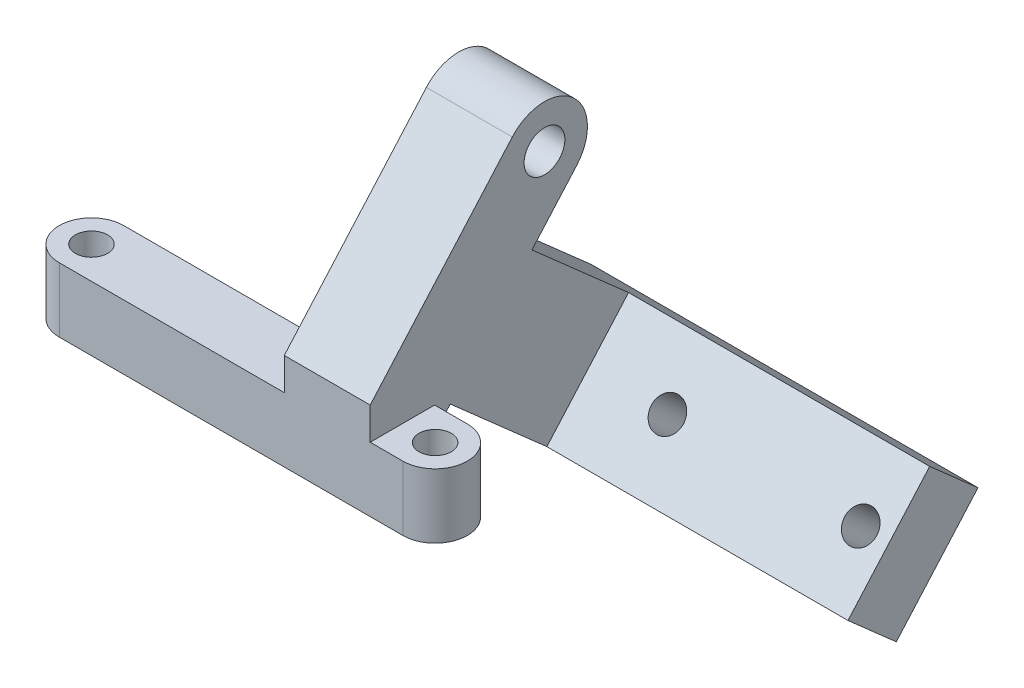
ISO-10303-21;
HEADER;
FILE_DESCRIPTION(('STEP AP214'),'2;1');
FILE_NAME('part.step','',(''),(''),'','','');
FILE_SCHEMA(('AUTOMOTIVE_DESIGN { 1 0 10303 214 1 1 1 1 }'));
ENDSEC;
DATA;
#1=APPLICATION_CONTEXT('core data for automotive mechanical design processes');
#2=APPLICATION_PROTOCOL_DEFINITION('international standard','automotive_design',2000,#1);
#3=PRODUCT_CONTEXT('',#1,'mechanical');
#4=PRODUCT('Part','Part','',(#3));
#5=PRODUCT_RELATED_PRODUCT_CATEGORY('part','',(#4));
#6=PRODUCT_DEFINITION_FORMATION('','',#4);
#7=PRODUCT_DEFINITION_CONTEXT('part definition',#1,'design');
#8=PRODUCT_DEFINITION('design','',#6,#7);
#9=PRODUCT_DEFINITION_SHAPE('','',#8);
#10=(LENGTH_UNIT() NAMED_UNIT(*) SI_UNIT(.MILLI.,.METRE.));
#11=(NAMED_UNIT(*) PLANE_ANGLE_UNIT() SI_UNIT($,.RADIAN.));
#12=(NAMED_UNIT(*) SI_UNIT($,.STERADIAN.) SOLID_ANGLE_UNIT());
#13=UNCERTAINTY_MEASURE_WITH_UNIT(LENGTH_MEASURE(1.E-05),#10,'distance_accuracy_value','');
#14=(GEOMETRIC_REPRESENTATION_CONTEXT(3) GLOBAL_UNCERTAINTY_ASSIGNED_CONTEXT((#13)) GLOBAL_UNIT_ASSIGNED_CONTEXT((#10,
#11,#12)) REPRESENTATION_CONTEXT('',''));
#15=CARTESIAN_POINT('',(0.,0.,0.));
#16=DIRECTION('',(0.,0.,1.));
#17=DIRECTION('',(1.,0.,0.));
#18=AXIS2_PLACEMENT_3D('',#15,#16,#17);
#19=CARTESIAN_POINT('',(-9.72275825615475,3.,0.));
#20=DIRECTION('',(1.,0.,0.));
#21=DIRECTION('',(0.,0.,-1.));
#22=AXIS2_PLACEMENT_3D('',#19,#20,#21);
#23=PLANE('',#22);
#24=CARTESIAN_POINT('',(-9.72275825615475,15.3542486889354,-13.228756555323));
#25=DIRECTION('',(1.,0.,0.));
#26=DIRECTION('',(0.,0.,-1.));
#27=AXIS2_PLACEMENT_3D('',#24,#25,#26);
#28=CIRCLE('',#27,1.9);
#29=CARTESIAN_POINT('',(-9.72275825615475,15.3542486889354,-15.128756555323));
#30=VERTEX_POINT('',#29);
#31=EDGE_CURVE('E192',#30,#30,#28,.T.);
#32=ORIENTED_EDGE('',*,*,#31,.F.);
#33=EDGE_LOOP('',(#32));
#34=FACE_BOUND('',#33,.T.);
#35=DIRECTION('',(0.,0.661437827766149,0.749999999999999));
#36=VECTOR('',#35,1.);
#37=CARTESIAN_POINT('',(-9.72275825615475,-12.5507639353434,-17.9521819766698));
#38=LINE('',#37,#36);
#39=CARTESIAN_POINT('',(-9.72275825615475,-8.58213696874647,-13.4521819766698));
#40=VERTEX_POINT('',#39);
#41=CARTESIAN_POINT('',(-9.72275825615475,-0.644883035552679,-4.45218197666983));
#42=VERTEX_POINT('',#41);
#43=EDGE_CURVE('E217',#40,#42,#38,.T.);
#44=ORIENTED_EDGE('',*,*,#43,.F.);
#45=DIRECTION('',(0.,0.749999999999999,-0.661437827766149));
#46=VECTOR('',#45,1.);
#47=CARTESIAN_POINT('',(-9.72275825615475,-8.74052144284916,-13.3125));
#48=LINE('',#47,#46);
#49=CARTESIAN_POINT('',(-9.72275825615475,0.0428630312535299,-21.0587169959805));
#50=VERTEX_POINT('',#49);
#51=EDGE_CURVE('E182',#40,#50,#48,.T.);
#52=ORIENTED_EDGE('',*,*,#51,.T.);
#53=DIRECTION('',(0.,0.661437827766149,0.749999999999999));
#54=VECTOR('',#53,1.);
#55=CARTESIAN_POINT('',(-9.72275825615475,-3.92576393534336,-25.5587169959805));
#56=LINE('',#55,#54);
#57=CARTESIAN_POINT('',(-9.72275825615475,7.98011696444732,-12.0587169959806));
#58=VERTEX_POINT('',#57);
#59=EDGE_CURVE('E219',#50,#58,#56,.T.);
#60=ORIENTED_EDGE('',*,*,#59,.T.);
#61=DIRECTION('',(0.,-0.749999999999999,0.661437827766149));
#62=VECTOR('',#61,1.);
#63=CARTESIAN_POINT('',(-9.72275825615475,12.7084973778708,-16.228756555323));
#64=LINE('',#63,#62);
#65=CARTESIAN_POINT('',(-9.72275825615475,12.7084973778708,-16.228756555323));
#66=VERTEX_POINT('',#65);
#67=EDGE_CURVE('E241',#66,#58,#64,.T.);
#68=ORIENTED_EDGE('',*,*,#67,.F.);
#69=CARTESIAN_POINT('',(-9.72275825615475,15.3542486889354,-13.228756555323));
#70=DIRECTION('',(1.,0.,0.));
#71=DIRECTION('',(0.,0.,-1.));
#72=AXIS2_PLACEMENT_3D('',#69,#70,#71);
#73=CIRCLE('',#72,4.00000000000001);
#74=CARTESIAN_POINT('',(-9.72275825615475,18.,-10.228756555323));
#75=VERTEX_POINT('',#74);
#76=EDGE_CURVE('E226',#66,#75,#73,.T.);
#77=ORIENTED_EDGE('',*,*,#76,.T.);
#78=DIRECTION('',(0.,-0.749999999999999,0.661437827766149));
#79=VECTOR('',#78,1.);
#80=CARTESIAN_POINT('',(-9.72275825615475,18.,-10.228756555323));
#81=LINE('',#80,#79);
#82=CARTESIAN_POINT('',(-9.72275825615475,3.,3.));
#83=VERTEX_POINT('',#82);
#84=EDGE_CURVE('E238',#75,#83,#81,.T.);
#85=ORIENTED_EDGE('',*,*,#84,.T.);
#86=DIRECTION('',(0.,-1.,0.));
#87=VECTOR('',#86,1.);
#88=CARTESIAN_POINT('',(-9.72275825615475,3.,3.));
#89=LINE('',#88,#87);
#90=CARTESIAN_POINT('',(-9.72275825615475,0.,3.));
#91=VERTEX_POINT('',#90);
#92=EDGE_CURVE('E260',#83,#91,#89,.T.);
#93=ORIENTED_EDGE('',*,*,#92,.T.);
#94=DIRECTION('',(0.,0.,1.));
#95=VECTOR('',#94,1.);
#96=CARTESIAN_POINT('',(-9.72275825615475,0.,0.));
#97=LINE('',#96,#95);
#98=CARTESIAN_POINT('',(-9.72275825615475,0.,-3.));
#99=VERTEX_POINT('',#98);
#100=EDGE_CURVE('E256',#99,#91,#97,.T.);
#101=ORIENTED_EDGE('',*,*,#100,.F.);
#102=DIRECTION('',(0.,1.,0.));
#103=VECTOR('',#102,1.);
#104=CARTESIAN_POINT('',(-9.72275825615475,-6.,-3.));
#105=LINE('',#104,#103);
#106=CARTESIAN_POINT('',(-9.72275825615475,-2.29150262212921,-3.));
#107=VERTEX_POINT('',#106);
#108=EDGE_CURVE('E232',#107,#99,#105,.T.);
#109=ORIENTED_EDGE('',*,*,#108,.F.);
#110=EDGE_CURVE('E221',#42,#107,#64,.T.);
#111=ORIENTED_EDGE('',*,*,#110,.F.);
#112=EDGE_LOOP('',(#44,#52,#60,#68,#77,#85,#93,#101,#109,#111));
#113=FACE_BOUND('',#112,.T.);
#114=ADVANCED_FACE('F53',(#34,#113),#23,.T.);
#115=CARTESIAN_POINT('',(-17.7227582561547,12.7084973778708,-16.228756555323));
#116=DIRECTION('',(0.,0.661437827766149,0.749999999999999));
#117=DIRECTION('',(0.,-0.749999999999999,0.661437827766149));
#118=AXIS2_PLACEMENT_3D('',#115,#116,#117);
#119=PLANE('',#118);
#120=DIRECTION('',(1.,0.,0.));
#121=VECTOR('',#120,1.);
#122=CARTESIAN_POINT('',(-9.72275825615475,7.98011696444732,-12.0587169959806));
#123=LINE('',#122,#121);
#124=CARTESIAN_POINT('',(-17.683307842008,7.98011696444732,-12.0587169959806));
#125=VERTEX_POINT('',#124);
#126=EDGE_CURVE('E201',#125,#58,#123,.T.);
#127=ORIENTED_EDGE('',*,*,#126,.F.);
#128=DIRECTION('',(0.,0.749999999999999,-0.661437827766149));
#129=VECTOR('',#128,1.);
#130=CARTESIAN_POINT('',(-17.683307842008,7.98011696444732,-12.0587169959806));
#131=LINE('',#130,#129);
#132=CARTESIAN_POINT('',(-17.683307842008,-0.644883035552683,-4.45218197666983));
#133=VERTEX_POINT('',#132);
#134=EDGE_CURVE('E204',#133,#125,#131,.T.);
#135=ORIENTED_EDGE('',*,*,#134,.F.);
#136=DIRECTION('',(-1.,0.,0.));
#137=VECTOR('',#136,1.);
#138=CARTESIAN_POINT('',(-9.72275825615475,-0.644883035552682,-4.45218197666983));
#139=LINE('',#138,#137);
#140=EDGE_CURVE('E211',#42,#133,#139,.T.);
#141=ORIENTED_EDGE('',*,*,#140,.F.);
#142=ORIENTED_EDGE('',*,*,#110,.T.);
#143=DIRECTION('',(1.,0.,0.));
#144=VECTOR('',#143,1.);
#145=CARTESIAN_POINT('',(-17.7227582561547,-2.2915026221292,-3.));
#146=LINE('',#145,#144);
#147=CARTESIAN_POINT('',(-17.7227582561547,-2.29150262212921,-3.));
#148=VERTEX_POINT('',#147);
#149=EDGE_CURVE('E229',#148,#107,#146,.T.);
#150=ORIENTED_EDGE('',*,*,#149,.F.);
#151=DIRECTION('',(0.,-0.749999999999999,0.661437827766149));
#152=VECTOR('',#151,1.);
#153=CARTESIAN_POINT('',(-17.7227582561547,12.7084973778708,-16.228756555323));
#154=LINE('',#153,#152);
#155=CARTESIAN_POINT('',(-17.7227582561547,12.7084973778708,-16.228756555323));
#156=VERTEX_POINT('',#155);
#157=EDGE_CURVE('E234',#156,#148,#154,.T.);
#158=ORIENTED_EDGE('',*,*,#157,.F.);
#159=DIRECTION('',(1.,0.,0.));
#160=VECTOR('',#159,1.);
#161=CARTESIAN_POINT('',(-17.7227582561547,12.7084973778708,-16.228756555323));
#162=LINE('',#161,#160);
#163=EDGE_CURVE('E225',#156,#66,#162,.T.);
#164=ORIENTED_EDGE('',*,*,#163,.T.);
#165=ORIENTED_EDGE('',*,*,#67,.T.);
#166=EDGE_LOOP('',(#127,#135,#141,#142,#150,#158,#164,#165));
#167=FACE_BOUND('',#166,.T.);
#168=ADVANCED_FACE('F308',(#167),#119,.F.);
#169=CARTESIAN_POINT('',(0.,-6.,-3.));
#170=DIRECTION('',(0.,0.,1.));
#171=DIRECTION('',(1.,0.,0.));
#172=AXIS2_PLACEMENT_3D('',#169,#170,#171);
#173=PLANE('',#172);
#174=DIRECTION('',(0.,1.,0.));
#175=VECTOR('',#174,1.);
#176=CARTESIAN_POINT('',(-17.7227582561547,-6.,-3.));
#177=LINE('',#176,#175);
#178=CARTESIAN_POINT('',(-17.7227582561547,0.,-3.));
#179=VERTEX_POINT('',#178);
#180=EDGE_CURVE('E251',#148,#179,#177,.T.);
#181=ORIENTED_EDGE('',*,*,#180,.F.);
#182=ORIENTED_EDGE('',*,*,#149,.T.);
#183=ORIENTED_EDGE('',*,*,#108,.T.);
#184=DIRECTION('',(1.,0.,0.));
#185=VECTOR('',#184,1.);
#186=CARTESIAN_POINT('',(0.,0.,-3.));
#187=LINE('',#186,#185);
#188=CARTESIAN_POINT('',(-6.67696888733747,0.,-3.));
#189=VERTEX_POINT('',#188);
#190=EDGE_CURVE('E348',#99,#189,#187,.T.);
#191=ORIENTED_EDGE('',*,*,#190,.T.);
#192=DIRECTION('',(0.,1.,0.));
#193=VECTOR('',#192,1.);
#194=CARTESIAN_POINT('',(-6.67696888733747,-6.,-3.));
#195=LINE('',#194,#193);
#196=CARTESIAN_POINT('',(-6.67696888733747,-6.,-3.));
#197=VERTEX_POINT('',#196);
#198=EDGE_CURVE('E389',#197,#189,#195,.T.);
#199=ORIENTED_EDGE('',*,*,#198,.F.);
#200=DIRECTION('',(1.,0.,0.));
#201=VECTOR('',#200,1.);
#202=CARTESIAN_POINT('',(0.,-6.,-3.));
#203=LINE('',#202,#201);
#204=CARTESIAN_POINT('',(-38.6769688873375,-6.,-3.));
#205=VERTEX_POINT('',#204);
#206=EDGE_CURVE('E380',#205,#197,#203,.T.);
#207=ORIENTED_EDGE('',*,*,#206,.F.);
#208=DIRECTION('',(0.,1.,0.));
#209=VECTOR('',#208,1.);
#210=CARTESIAN_POINT('',(-38.6769688873375,-6.,-3.));
#211=LINE('',#210,#209);
#212=CARTESIAN_POINT('',(-38.6769688873375,0.,-3.));
#213=VERTEX_POINT('',#212);
#214=EDGE_CURVE('E62',#205,#213,#211,.T.);
#215=ORIENTED_EDGE('',*,*,#214,.T.);
#216=EDGE_CURVE('E339',#213,#179,#187,.T.);
#217=ORIENTED_EDGE('',*,*,#216,.T.);
#218=EDGE_LOOP('',(#181,#182,#183,#191,#199,#207,#215,#217));
#219=FACE_BOUND('',#218,.T.);
#220=ADVANCED_FACE('F400',(#219),#173,.F.);
#221=CARTESIAN_POINT('',(0.,0.,0.));
#222=DIRECTION('',(0.,1.,0.));
#223=DIRECTION('',(0.,0.,1.));
#224=AXIS2_PLACEMENT_3D('',#221,#222,#223);
#225=PLANE('',#224);
#226=CARTESIAN_POINT('',(-6.67696888733747,0.,0.));
#227=DIRECTION('',(0.,1.,0.));
#228=DIRECTION('',(0.,0.,1.));
#229=AXIS2_PLACEMENT_3D('',#226,#227,#228);
#230=CIRCLE('',#229,1.5);
#231=CARTESIAN_POINT('',(-6.67696888733747,0.,1.5));
#232=VERTEX_POINT('',#231);
#233=EDGE_CURVE('E376',#232,#232,#230,.T.);
#234=ORIENTED_EDGE('',*,*,#233,.F.);
#235=EDGE_LOOP('',(#234));
#236=FACE_BOUND('',#235,.T.);
#237=ORIENTED_EDGE('',*,*,#190,.F.);
#238=ORIENTED_EDGE('',*,*,#100,.T.);
#239=DIRECTION('',(1.,0.,0.));
#240=VECTOR('',#239,1.);
#241=CARTESIAN_POINT('',(0.,0.,3.));
#242=LINE('',#241,#240);
#243=CARTESIAN_POINT('',(-6.67696888733747,0.,3.));
#244=VERTEX_POINT('',#243);
#245=EDGE_CURVE('E325',#91,#244,#242,.T.);
#246=ORIENTED_EDGE('',*,*,#245,.T.);
#247=CARTESIAN_POINT('',(-6.67696888733747,0.,0.));
#248=DIRECTION('',(0.,1.,0.));
#249=DIRECTION('',(0.,0.,1.));
#250=AXIS2_PLACEMENT_3D('',#247,#248,#249);
#251=CIRCLE('',#250,3.);
#252=EDGE_CURVE('E334',#244,#189,#251,.T.);
#253=ORIENTED_EDGE('',*,*,#252,.T.);
#254=EDGE_LOOP('',(#237,#238,#246,#253));
#255=FACE_BOUND('',#254,.T.);
#256=ADVANCED_FACE('F403',(#236,#255),#225,.T.);
#257=CARTESIAN_POINT('',(0.,-6.,3.));
#258=DIRECTION('',(0.,0.,1.));
#259=DIRECTION('',(1.,0.,0.));
#260=AXIS2_PLACEMENT_3D('',#257,#258,#259);
#261=PLANE('',#260);
#262=CARTESIAN_POINT('',(-38.6769688873375,0.,3.));
#263=VERTEX_POINT('',#262);
#264=CARTESIAN_POINT('',(-17.7227582561547,0.,3.));
#265=VERTEX_POINT('',#264);
#266=EDGE_CURVE('E331',#263,#265,#242,.T.);
#267=ORIENTED_EDGE('',*,*,#266,.F.);
#268=DIRECTION('',(0.,1.,0.));
#269=VECTOR('',#268,1.);
#270=CARTESIAN_POINT('',(-38.6769688873375,-6.,3.));
#271=LINE('',#270,#269);
#272=CARTESIAN_POINT('',(-38.6769688873375,-6.,3.));
#273=VERTEX_POINT('',#272);
#274=EDGE_CURVE('E12',#273,#263,#271,.T.);
#275=ORIENTED_EDGE('',*,*,#274,.F.);
#276=DIRECTION('',(1.,0.,0.));
#277=VECTOR('',#276,1.);
#278=CARTESIAN_POINT('',(0.,-6.,3.));
#279=LINE('',#278,#277);
#280=CARTESIAN_POINT('',(-6.67696888733747,-6.,3.));
#281=VERTEX_POINT('',#280);
#282=EDGE_CURVE('E365',#273,#281,#279,.T.);
#283=ORIENTED_EDGE('',*,*,#282,.T.);
#284=DIRECTION('',(0.,1.,0.));
#285=VECTOR('',#284,1.);
#286=CARTESIAN_POINT('',(-6.67696888733747,-6.,3.));
#287=LINE('',#286,#285);
#288=EDGE_CURVE('E327',#281,#244,#287,.T.);
#289=ORIENTED_EDGE('',*,*,#288,.T.);
#290=ORIENTED_EDGE('',*,*,#245,.F.);
#291=ORIENTED_EDGE('',*,*,#92,.F.);
#292=DIRECTION('',(1.,0.,0.));
#293=VECTOR('',#292,1.);
#294=CARTESIAN_POINT('',(0.,3.,3.));
#295=LINE('',#294,#293);
#296=CARTESIAN_POINT('',(-17.7227582561547,3.,3.));
#297=VERTEX_POINT('',#296);
#298=EDGE_CURVE('E257',#297,#83,#295,.T.);
#299=ORIENTED_EDGE('',*,*,#298,.F.);
#300=DIRECTION('',(0.,-1.,0.));
#301=VECTOR('',#300,1.);
#302=CARTESIAN_POINT('',(-17.7227582561547,3.,3.));
#303=LINE('',#302,#301);
#304=EDGE_CURVE('E273',#297,#265,#303,.T.);
#305=ORIENTED_EDGE('',*,*,#304,.T.);
#306=EDGE_LOOP('',(#267,#275,#283,#289,#290,#291,#299,#305));
#307=FACE_BOUND('',#306,.T.);
#308=ADVANCED_FACE('F55',(#307),#261,.T.);
#309=CARTESIAN_POINT('',(-38.6769688873375,-6.,0.));
#310=DIRECTION('',(0.,1.,0.));
#311=DIRECTION('',(0.,0.,1.));
#312=AXIS2_PLACEMENT_3D('',#309,#310,#311);
#313=CYLINDRICAL_SURFACE('',#312,3.);
#314=CARTESIAN_POINT('',(-38.6769688873375,0.,0.));
#315=DIRECTION('',(0.,1.,0.));
#316=DIRECTION('',(0.,0.,1.));
#317=AXIS2_PLACEMENT_3D('',#314,#315,#316);
#318=CIRCLE('',#317,3.);
#319=EDGE_CURVE('E351',#213,#263,#318,.T.);
#320=ORIENTED_EDGE('',*,*,#319,.F.);
#321=ORIENTED_EDGE('',*,*,#214,.F.);
#322=CARTESIAN_POINT('',(-38.6769688873375,-6.,0.));
#323=DIRECTION('',(0.,1.,0.));
#324=DIRECTION('',(0.,0.,1.));
#325=AXIS2_PLACEMENT_3D('',#322,#323,#324);
#326=CIRCLE('',#325,3.);
#327=EDGE_CURVE('E373',#205,#273,#326,.T.);
#328=ORIENTED_EDGE('',*,*,#327,.T.);
#329=ORIENTED_EDGE('',*,*,#274,.T.);
#330=EDGE_LOOP('',(#320,#321,#328,#329));
#331=FACE_BOUND('',#330,.T.);
#332=ADVANCED_FACE('F377',(#331),#313,.T.);
#333=CARTESIAN_POINT('',(-38.6769688873375,-6.,0.));
#334=DIRECTION('',(0.,1.,0.));
#335=DIRECTION('',(0.,0.,1.));
#336=AXIS2_PLACEMENT_3D('',#333,#334,#335);
#337=CYLINDRICAL_SURFACE('',#336,1.5);
#338=CARTESIAN_POINT('',(-38.6769688873375,-6.,0.));
#339=DIRECTION('',(0.,1.,0.));
#340=DIRECTION('',(0.,0.,1.));
#341=AXIS2_PLACEMENT_3D('',#338,#339,#340);
#342=CIRCLE('',#341,1.5);
#343=CARTESIAN_POINT('',(-38.6769688873375,-6.,1.5));
#344=VERTEX_POINT('',#343);
#345=EDGE_CURVE('E379',#344,#344,#342,.T.);
#346=ORIENTED_EDGE('',*,*,#345,.F.);
#347=EDGE_LOOP('',(#346));
#348=FACE_BOUND('',#347,.T.);
#349=CARTESIAN_POINT('',(-38.6769688873375,0.,0.));
#350=DIRECTION('',(0.,1.,0.));
#351=DIRECTION('',(0.,0.,1.));
#352=AXIS2_PLACEMENT_3D('',#349,#350,#351);
#353=CIRCLE('',#352,1.5);
#354=CARTESIAN_POINT('',(-38.6769688873375,0.,1.5));
#355=VERTEX_POINT('',#354);
#356=EDGE_CURVE('E395',#355,#355,#353,.T.);
#357=ORIENTED_EDGE('',*,*,#356,.T.);
#358=EDGE_LOOP('',(#357));
#359=FACE_BOUND('',#358,.T.);
#360=ADVANCED_FACE('F430',(#348,#359),#337,.F.);
#361=CARTESIAN_POINT('',(-6.67696888733747,-6.,0.));
#362=DIRECTION('',(0.,1.,0.));
#363=DIRECTION('',(0.,0.,1.));
#364=AXIS2_PLACEMENT_3D('',#361,#362,#363);
#365=CYLINDRICAL_SURFACE('',#364,3.);
#366=ORIENTED_EDGE('',*,*,#252,.F.);
#367=ORIENTED_EDGE('',*,*,#288,.F.);
#368=CARTESIAN_POINT('',(-6.67696888733747,-6.,0.));
#369=DIRECTION('',(0.,1.,0.));
#370=DIRECTION('',(0.,0.,1.));
#371=AXIS2_PLACEMENT_3D('',#368,#369,#370);
#372=CIRCLE('',#371,3.);
#373=EDGE_CURVE('E375',#281,#197,#372,.T.);
#374=ORIENTED_EDGE('',*,*,#373,.T.);
#375=ORIENTED_EDGE('',*,*,#198,.T.);
#376=EDGE_LOOP('',(#366,#367,#374,#375));
#377=FACE_BOUND('',#376,.T.);
#378=ADVANCED_FACE('F387',(#377),#365,.T.);
#379=CARTESIAN_POINT('',(-6.67696888733747,-6.,0.));
#380=DIRECTION('',(0.,1.,0.));
#381=DIRECTION('',(0.,0.,1.));
#382=AXIS2_PLACEMENT_3D('',#379,#380,#381);
#383=CYLINDRICAL_SURFACE('',#382,1.5);
#384=CARTESIAN_POINT('',(-6.67696888733747,-6.,0.));
#385=DIRECTION('',(0.,1.,0.));
#386=DIRECTION('',(0.,0.,1.));
#387=AXIS2_PLACEMENT_3D('',#384,#385,#386);
#388=CIRCLE('',#387,1.5);
#389=CARTESIAN_POINT('',(-6.67696888733747,-6.,1.5));
#390=VERTEX_POINT('',#389);
#391=EDGE_CURVE('E345',#390,#390,#388,.T.);
#392=ORIENTED_EDGE('',*,*,#391,.F.);
#393=EDGE_LOOP('',(#392));
#394=FACE_BOUND('',#393,.T.);
#395=ORIENTED_EDGE('',*,*,#233,.T.);
#396=EDGE_LOOP('',(#395));
#397=FACE_BOUND('',#396,.T.);
#398=ADVANCED_FACE('F424',(#394,#397),#383,.F.);
#399=CARTESIAN_POINT('',(0.,-6.,0.));
#400=DIRECTION('',(0.,1.,0.));
#401=DIRECTION('',(0.,0.,1.));
#402=AXIS2_PLACEMENT_3D('',#399,#400,#401);
#403=PLANE('',#402);
#404=ORIENTED_EDGE('',*,*,#282,.F.);
#405=ORIENTED_EDGE('',*,*,#327,.F.);
#406=ORIENTED_EDGE('',*,*,#206,.T.);
#407=ORIENTED_EDGE('',*,*,#373,.F.);
#408=EDGE_LOOP('',(#404,#405,#406,#407));
#409=FACE_BOUND('',#408,.T.);
#410=ORIENTED_EDGE('',*,*,#345,.T.);
#411=EDGE_LOOP('',(#410));
#412=FACE_BOUND('',#411,.T.);
#413=ORIENTED_EDGE('',*,*,#391,.T.);
#414=EDGE_LOOP('',(#413));
#415=FACE_BOUND('',#414,.T.);
#416=ADVANCED_FACE('F371',(#409,#412,#415),#403,.F.);
#417=DIRECTION('',(0.,0.,1.));
#418=VECTOR('',#417,1.);
#419=CARTESIAN_POINT('',(-17.7227582561547,0.,0.));
#420=LINE('',#419,#418);
#421=EDGE_CURVE('E261',#179,#265,#420,.T.);
#422=ORIENTED_EDGE('',*,*,#421,.F.);
#423=ORIENTED_EDGE('',*,*,#216,.F.);
#424=ORIENTED_EDGE('',*,*,#319,.T.);
#425=ORIENTED_EDGE('',*,*,#266,.T.);
#426=EDGE_LOOP('',(#422,#423,#424,#425));
#427=FACE_BOUND('',#426,.T.);
#428=ORIENTED_EDGE('',*,*,#356,.F.);
#429=EDGE_LOOP('',(#428));
#430=FACE_BOUND('',#429,.T.);
#431=ADVANCED_FACE('F361',(#427,#430),#225,.T.);
#432=CARTESIAN_POINT('',(-17.7227582561547,3.,0.));
#433=DIRECTION('',(1.,0.,0.));
#434=DIRECTION('',(0.,0.,-1.));
#435=AXIS2_PLACEMENT_3D('',#432,#433,#434);
#436=PLANE('',#435);
#437=CARTESIAN_POINT('',(-17.7227582561547,15.3542486889354,-13.228756555323));
#438=DIRECTION('',(1.,0.,0.));
#439=DIRECTION('',(0.,0.,-1.));
#440=AXIS2_PLACEMENT_3D('',#437,#438,#439);
#441=CIRCLE('',#440,1.9);
#442=CARTESIAN_POINT('',(-17.7227582561547,15.3542486889354,-15.128756555323));
#443=VERTEX_POINT('',#442);
#444=EDGE_CURVE('E189',#443,#443,#441,.T.);
#445=ORIENTED_EDGE('',*,*,#444,.T.);
#446=EDGE_LOOP('',(#445));
#447=FACE_BOUND('',#446,.T.);
#448=ORIENTED_EDGE('',*,*,#180,.T.);
#449=ORIENTED_EDGE('',*,*,#421,.T.);
#450=ORIENTED_EDGE('',*,*,#304,.F.);
#451=DIRECTION('',(0.,-0.749999999999999,0.661437827766149));
#452=VECTOR('',#451,1.);
#453=CARTESIAN_POINT('',(-17.7227582561547,18.,-10.228756555323));
#454=LINE('',#453,#452);
#455=CARTESIAN_POINT('',(-17.7227582561547,18.,-10.228756555323));
#456=VERTEX_POINT('',#455);
#457=EDGE_CURVE('E237',#456,#297,#454,.T.);
#458=ORIENTED_EDGE('',*,*,#457,.F.);
#459=CARTESIAN_POINT('',(-17.7227582561547,15.3542486889354,-13.228756555323));
#460=DIRECTION('',(1.,0.,0.));
#461=DIRECTION('',(0.,0.,-1.));
#462=AXIS2_PLACEMENT_3D('',#459,#460,#461);
#463=CIRCLE('',#462,4.00000000000001);
#464=EDGE_CURVE('E222',#156,#456,#463,.T.);
#465=ORIENTED_EDGE('',*,*,#464,.F.);
#466=ORIENTED_EDGE('',*,*,#157,.T.);
#467=EDGE_LOOP('',(#448,#449,#450,#458,#465,#466));
#468=FACE_BOUND('',#467,.T.);
#469=ADVANCED_FACE('F356',(#447,#468),#436,.F.);
#470=CARTESIAN_POINT('',(-17.7227582561547,15.3542486889354,-13.228756555323));
#471=DIRECTION('',(1.,0.,0.));
#472=DIRECTION('',(0.,0.,-1.));
#473=AXIS2_PLACEMENT_3D('',#470,#471,#472);
#474=CYLINDRICAL_SURFACE('',#473,4.00000000000001);
#475=ORIENTED_EDGE('',*,*,#76,.F.);
#476=ORIENTED_EDGE('',*,*,#163,.F.);
#477=ORIENTED_EDGE('',*,*,#464,.T.);
#478=DIRECTION('',(1.,0.,0.));
#479=VECTOR('',#478,1.);
#480=CARTESIAN_POINT('',(-17.7227582561547,18.,-10.228756555323));
#481=LINE('',#480,#479);
#482=EDGE_CURVE('E230',#456,#75,#481,.T.);
#483=ORIENTED_EDGE('',*,*,#482,.T.);
#484=EDGE_LOOP('',(#475,#476,#477,#483));
#485=FACE_BOUND('',#484,.T.);
#486=ADVANCED_FACE('F313',(#485),#474,.T.);
#487=CARTESIAN_POINT('',(-17.7227582561547,18.,-10.228756555323));
#488=DIRECTION('',(0.,0.661437827766149,0.749999999999999));
#489=DIRECTION('',(0.,-0.749999999999999,0.661437827766149));
#490=AXIS2_PLACEMENT_3D('',#487,#488,#489);
#491=PLANE('',#490);
#492=ORIENTED_EDGE('',*,*,#84,.F.);
#493=ORIENTED_EDGE('',*,*,#482,.F.);
#494=ORIENTED_EDGE('',*,*,#457,.T.);
#495=ORIENTED_EDGE('',*,*,#298,.T.);
#496=EDGE_LOOP('',(#492,#493,#494,#495));
#497=FACE_BOUND('',#496,.T.);
#498=ADVANCED_FACE('F317',(#497),#491,.T.);
#499=CARTESIAN_POINT('',(-9.72275825615475,-3.92576393534336,-25.5587169959805));
#500=DIRECTION('',(0.,-0.749999999999999,0.661437827766149));
#501=DIRECTION('',(0.,-0.661437827766149,-0.749999999999999));
#502=AXIS2_PLACEMENT_3D('',#499,#500,#501);
#503=PLANE('',#502);
#504=DIRECTION('',(0.,0.661437827766149,0.749999999999999));
#505=VECTOR('',#504,1.);
#506=CARTESIAN_POINT('',(-17.683307842008,-3.92576393534336,-25.5587169959805));
#507=LINE('',#506,#505);
#508=CARTESIAN_POINT('',(-17.683307842008,-3.92576393534336,-25.5587169959805));
#509=VERTEX_POINT('',#508);
#510=EDGE_CURVE('E208',#509,#125,#507,.T.);
#511=ORIENTED_EDGE('',*,*,#510,.T.);
#512=ORIENTED_EDGE('',*,*,#126,.T.);
#513=ORIENTED_EDGE('',*,*,#59,.F.);
#514=DIRECTION('',(-1.,0.,0.));
#515=VECTOR('',#514,1.);
#516=CARTESIAN_POINT('',(18.316692157992,0.0428630312535325,-21.0587169959805));
#517=LINE('',#516,#515);
#518=CARTESIAN_POINT('',(18.316692157992,0.0428630312535325,-21.0587169959805));
#519=VERTEX_POINT('',#518);
#520=EDGE_CURVE('E70',#519,#50,#517,.T.);
#521=ORIENTED_EDGE('',*,*,#520,.F.);
#522=DIRECTION('',(0.,0.661437827766149,0.749999999999998));
#523=VECTOR('',#522,1.);
#524=CARTESIAN_POINT('',(18.316692157992,-3.92576393534336,-25.5587169959805));
#525=LINE('',#524,#523);
#526=CARTESIAN_POINT('',(18.316692157992,-3.92576393534336,-25.5587169959805));
#527=VERTEX_POINT('',#526);
#528=EDGE_CURVE('E177',#527,#519,#525,.T.);
#529=ORIENTED_EDGE('',*,*,#528,.F.);
#530=DIRECTION('',(1.,0.,0.));
#531=VECTOR('',#530,1.);
#532=CARTESIAN_POINT('',(-9.72275825615475,-3.92576393534336,-25.5587169959805));
#533=LINE('',#532,#531);
#534=EDGE_CURVE('E202',#509,#527,#533,.T.);
#535=ORIENTED_EDGE('',*,*,#534,.F.);
#536=EDGE_LOOP('',(#511,#512,#513,#521,#529,#535));
#537=FACE_BOUND('',#536,.T.);
#538=ADVANCED_FACE('F301',(#537),#503,.F.);
#539=CARTESIAN_POINT('',(-9.72275825615475,-12.5507639353434,-17.9521819766698));
#540=DIRECTION('',(0.,0.749999999999999,-0.661437827766149));
#541=DIRECTION('',(0.,0.661437827766149,0.749999999999999));
#542=AXIS2_PLACEMENT_3D('',#539,#540,#541);
#543=PLANE('',#542);
#544=DIRECTION('',(-1.,0.,0.));
#545=VECTOR('',#544,1.);
#546=CARTESIAN_POINT('',(-9.72275825615475,-12.5507639353434,-17.9521819766698));
#547=LINE('',#546,#545);
#548=CARTESIAN_POINT('',(18.316692157992,-12.5507639353434,-17.9521819766698));
#549=VERTEX_POINT('',#548);
#550=CARTESIAN_POINT('',(-17.683307842008,-12.5507639353434,-17.9521819766698));
#551=VERTEX_POINT('',#550);
#552=EDGE_CURVE('E188',#549,#551,#547,.T.);
#553=ORIENTED_EDGE('',*,*,#552,.F.);
#554=DIRECTION('',(0.,0.66143782776615,0.749999999999998));
#555=VECTOR('',#554,1.);
#556=CARTESIAN_POINT('',(18.316692157992,-12.5507639353434,-17.9521819766698));
#557=LINE('',#556,#555);
#558=CARTESIAN_POINT('',(18.316692157992,-8.58213696874647,-13.4521819766698));
#559=VERTEX_POINT('',#558);
#560=EDGE_CURVE('E174',#549,#559,#557,.T.);
#561=ORIENTED_EDGE('',*,*,#560,.T.);
#562=DIRECTION('',(-1.,0.,0.));
#563=VECTOR('',#562,1.);
#564=CARTESIAN_POINT('',(18.316692157992,-8.58213696874647,-13.4521819766698));
#565=LINE('',#564,#563);
#566=EDGE_CURVE('E180',#559,#40,#565,.T.);
#567=ORIENTED_EDGE('',*,*,#566,.T.);
#568=ORIENTED_EDGE('',*,*,#43,.T.);
#569=ORIENTED_EDGE('',*,*,#140,.T.);
#570=DIRECTION('',(0.,0.661437827766149,0.749999999999999));
#571=VECTOR('',#570,1.);
#572=CARTESIAN_POINT('',(-17.683307842008,-12.5507639353434,-17.9521819766698));
#573=LINE('',#572,#571);
#574=EDGE_CURVE('E78',#551,#133,#573,.T.);
#575=ORIENTED_EDGE('',*,*,#574,.F.);
#576=EDGE_LOOP('',(#553,#561,#567,#568,#569,#575));
#577=FACE_BOUND('',#576,.T.);
#578=ADVANCED_FACE('F187',(#577),#543,.F.);
#579=CARTESIAN_POINT('',(-17.683307842008,-3.92576393534336,-25.5587169959805));
#580=DIRECTION('',(1.,0.,0.));
#581=DIRECTION('',(0.,0.,-1.));
#582=AXIS2_PLACEMENT_3D('',#579,#580,#581);
#583=PLANE('',#582);
#584=ORIENTED_EDGE('',*,*,#574,.T.);
#585=ORIENTED_EDGE('',*,*,#134,.T.);
#586=ORIENTED_EDGE('',*,*,#510,.F.);
#587=DIRECTION('',(0.,0.749999999999999,-0.661437827766149));
#588=VECTOR('',#587,1.);
#589=CARTESIAN_POINT('',(-17.683307842008,-3.92576393534336,-25.5587169959805));
#590=LINE('',#589,#588);
#591=EDGE_CURVE('E206',#551,#509,#590,.T.);
#592=ORIENTED_EDGE('',*,*,#591,.F.);
#593=EDGE_LOOP('',(#584,#585,#586,#592));
#594=FACE_BOUND('',#593,.T.);
#595=ADVANCED_FACE('F295',(#594),#583,.F.);
#596=CARTESIAN_POINT('',(0.,-14.396648409446,-16.3242648875262));
#597=DIRECTION('',(0.,0.661437827766149,0.749999999999999));
#598=DIRECTION('',(0.,-0.749999999999999,0.661437827766149));
#599=AXIS2_PLACEMENT_3D('',#596,#597,#598);
#600=PLANE('',#599);
#601=CARTESIAN_POINT('',(15.6551644689405,-8.18814090843112,-21.7996538410477));
#602=DIRECTION('',(0.,-0.661437827766149,-0.749999999999999));
#603=DIRECTION('',(0.,0.749999999999999,-0.661437827766149));
#604=AXIS2_PLACEMENT_3D('',#601,#602,#603);
#605=CIRCLE('',#604,1.5);
#606=CARTESIAN_POINT('',(15.6551644689405,-7.06314090843112,-22.7918105826969));
#607=VERTEX_POINT('',#606);
#608=EDGE_CURVE('E277',#607,#607,#605,.T.);
#609=ORIENTED_EDGE('',*,*,#608,.F.);
#610=EDGE_LOOP('',(#609));
#611=FACE_BOUND('',#610,.T.);
#612=CARTESIAN_POINT('',(-2.34483553105949,-8.18814090843112,-21.7996538410477));
#613=DIRECTION('',(0.,-0.661437827766149,-0.749999999999999));
#614=DIRECTION('',(0.,0.749999999999999,-0.661437827766149));
#615=AXIS2_PLACEMENT_3D('',#612,#613,#614);
#616=CIRCLE('',#615,1.50000000000001);
#617=CARTESIAN_POINT('',(-2.34483553105949,-7.06314090843111,-22.7918105826969));
#618=VERTEX_POINT('',#617);
#619=EDGE_CURVE('E282',#618,#618,#616,.T.);
#620=ORIENTED_EDGE('',*,*,#619,.F.);
#621=EDGE_LOOP('',(#620));
#622=FACE_BOUND('',#621,.T.);
#623=ORIENTED_EDGE('',*,*,#534,.T.);
#624=DIRECTION('',(0.,-0.749999999999999,0.661437827766149));
#625=VECTOR('',#624,1.);
#626=CARTESIAN_POINT('',(18.316692157992,-3.92576393534336,-25.5587169959805));
#627=LINE('',#626,#625);
#628=EDGE_CURVE('E185',#527,#549,#627,.T.);
#629=ORIENTED_EDGE('',*,*,#628,.T.);
#630=ORIENTED_EDGE('',*,*,#552,.T.);
#631=ORIENTED_EDGE('',*,*,#591,.T.);
#632=EDGE_LOOP('',(#623,#629,#630,#631));
#633=FACE_BOUND('',#632,.T.);
#634=ADVANCED_FACE('F292',(#611,#622,#633),#600,.F.);
#635=CARTESIAN_POINT('',(18.316692157992,0.0428630312535325,-21.0587169959805));
#636=DIRECTION('',(0.,-0.661437827766149,-0.749999999999999));
#637=DIRECTION('',(0.,0.749999999999999,-0.661437827766149));
#638=AXIS2_PLACEMENT_3D('',#635,#636,#637);
#639=PLANE('',#638);
#640=CARTESIAN_POINT('',(15.6551644689405,-4.21951394183422,-17.2996538410477));
#641=DIRECTION('',(0.,-0.661437827766149,-0.749999999999999));
#642=DIRECTION('',(0.,0.749999999999999,-0.661437827766149));
#643=AXIS2_PLACEMENT_3D('',#640,#641,#642);
#644=CIRCLE('',#643,1.5);
#645=CARTESIAN_POINT('',(15.6551644689405,-3.09451394183423,-18.2918105826969));
#646=VERTEX_POINT('',#645);
#647=EDGE_CURVE('E57',#646,#646,#644,.T.);
#648=ORIENTED_EDGE('',*,*,#647,.T.);
#649=EDGE_LOOP('',(#648));
#650=FACE_BOUND('',#649,.T.);
#651=CARTESIAN_POINT('',(-2.34483553105949,-4.21951394183422,-17.2996538410477));
#652=DIRECTION('',(0.,-0.661437827766149,-0.749999999999999));
#653=DIRECTION('',(0.,0.749999999999999,-0.661437827766149));
#654=AXIS2_PLACEMENT_3D('',#651,#652,#653);
#655=CIRCLE('',#654,1.50000000000001);
#656=CARTESIAN_POINT('',(-2.34483553105949,-3.09451394183422,-18.2918105826969));
#657=VERTEX_POINT('',#656);
#658=EDGE_CURVE('E275',#657,#657,#655,.T.);
#659=ORIENTED_EDGE('',*,*,#658,.T.);
#660=EDGE_LOOP('',(#659));
#661=FACE_BOUND('',#660,.T.);
#662=ORIENTED_EDGE('',*,*,#51,.F.);
#663=ORIENTED_EDGE('',*,*,#566,.F.);
#664=DIRECTION('',(0.,-0.749999999999999,0.661437827766149));
#665=VECTOR('',#664,1.);
#666=CARTESIAN_POINT('',(18.316692157992,0.0428630312535325,-21.0587169959805));
#667=LINE('',#666,#665);
#668=EDGE_CURVE('E169',#519,#559,#667,.T.);
#669=ORIENTED_EDGE('',*,*,#668,.F.);
#670=ORIENTED_EDGE('',*,*,#520,.T.);
#671=EDGE_LOOP('',(#662,#663,#669,#670));
#672=FACE_BOUND('',#671,.T.);
#673=ADVANCED_FACE('F181',(#650,#661,#672),#639,.F.);
#674=CARTESIAN_POINT('',(18.316692157992,0.,0.));
#675=DIRECTION('',(1.,0.,0.));
#676=DIRECTION('',(0.,0.,-1.));
#677=AXIS2_PLACEMENT_3D('',#674,#675,#676);
#678=PLANE('',#677);
#679=ORIENTED_EDGE('',*,*,#560,.F.);
#680=ORIENTED_EDGE('',*,*,#628,.F.);
#681=ORIENTED_EDGE('',*,*,#528,.T.);
#682=ORIENTED_EDGE('',*,*,#668,.T.);
#683=EDGE_LOOP('',(#679,#680,#681,#682));
#684=FACE_BOUND('',#683,.T.);
#685=ADVANCED_FACE('F171',(#684),#678,.T.);
#686=CARTESIAN_POINT('',(-28.7227582561548,15.3542486889354,-13.228756555323));
#687=DIRECTION('',(1.,0.,0.));
#688=DIRECTION('',(0.,0.,-1.));
#689=AXIS2_PLACEMENT_3D('',#686,#687,#688);
#690=CYLINDRICAL_SURFACE('',#689,1.9);
#691=ORIENTED_EDGE('',*,*,#31,.T.);
#692=EDGE_LOOP('',(#691));
#693=FACE_BOUND('',#692,.T.);
#694=ORIENTED_EDGE('',*,*,#444,.F.);
#695=EDGE_LOOP('',(#694));
#696=FACE_BOUND('',#695,.T.);
#697=ADVANCED_FACE('F501',(#693,#696),#690,.F.);
#698=CARTESIAN_POINT('',(-2.34483553105949,-1.57376263076963,-14.2996538410477));
#699=DIRECTION('',(0.,-0.661437827766149,-0.749999999999999));
#700=DIRECTION('',(0.,0.749999999999999,-0.661437827766149));
#701=AXIS2_PLACEMENT_3D('',#698,#699,#700);
#702=CYLINDRICAL_SURFACE('',#701,1.50000000000001);
#703=ORIENTED_EDGE('',*,*,#619,.T.);
#704=EDGE_LOOP('',(#703));
#705=FACE_BOUND('',#704,.T.);
#706=ORIENTED_EDGE('',*,*,#658,.F.);
#707=EDGE_LOOP('',(#706));
#708=FACE_BOUND('',#707,.T.);
#709=ADVANCED_FACE('F289',(#705,#708),#702,.F.);
#710=CARTESIAN_POINT('',(15.6551644689405,-1.57376263076963,-14.2996538410477));
#711=DIRECTION('',(0.,-0.661437827766149,-0.749999999999999));
#712=DIRECTION('',(0.,0.749999999999999,-0.661437827766149));
#713=AXIS2_PLACEMENT_3D('',#710,#711,#712);
#714=CYLINDRICAL_SURFACE('',#713,1.5);
#715=ORIENTED_EDGE('',*,*,#608,.T.);
#716=EDGE_LOOP('',(#715));
#717=FACE_BOUND('',#716,.T.);
#718=ORIENTED_EDGE('',*,*,#647,.F.);
#719=EDGE_LOOP('',(#718));
#720=FACE_BOUND('',#719,.T.);
#721=ADVANCED_FACE('F649',(#717,#720),#714,.F.);
#722=CLOSED_SHELL('',(#114,#168,#220,#256,#308,#332,#360,#378,#398,#416,#431,#469,#486,#498,
#538,#578,#595,#634,#673,#685,#697,#709,#721));
#723=MANIFOLD_SOLID_BREP('B2',#722);
#724=ADVANCED_BREP_SHAPE_REPRESENTATION('',(#18,#723),#14);
#725=SHAPE_DEFINITION_REPRESENTATION(#9,#724);
ENDSEC;
END-ISO-10303-21;
